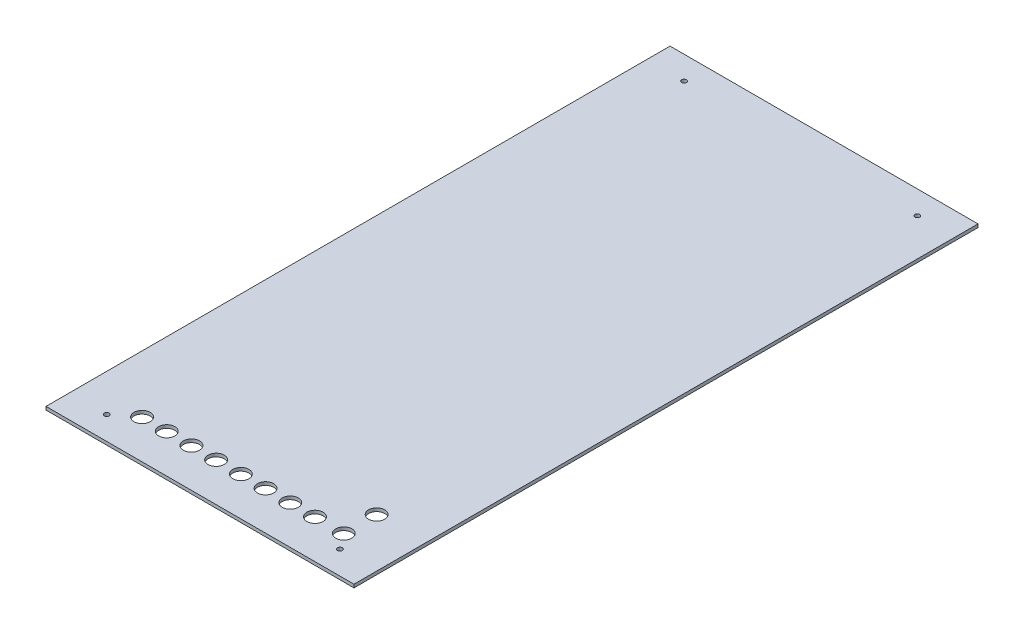
ISO-10303-21;
HEADER;
FILE_DESCRIPTION(('STEP AP214'),'2;1');
FILE_NAME('part.step','',(''),(''),'','','');
FILE_SCHEMA(('AUTOMOTIVE_DESIGN { 1 0 10303 214 1 1 1 1 }'));
ENDSEC;
DATA;
#1=APPLICATION_CONTEXT('core data for automotive mechanical design processes');
#2=APPLICATION_PROTOCOL_DEFINITION('international standard','automotive_design',2000,#1);
#3=PRODUCT_CONTEXT('',#1,'mechanical');
#4=PRODUCT('Part','Part','',(#3));
#5=PRODUCT_RELATED_PRODUCT_CATEGORY('part','',(#4));
#6=PRODUCT_DEFINITION_FORMATION('','',#4);
#7=PRODUCT_DEFINITION_CONTEXT('part definition',#1,'design');
#8=PRODUCT_DEFINITION('design','',#6,#7);
#9=PRODUCT_DEFINITION_SHAPE('','',#8);
#10=(LENGTH_UNIT() NAMED_UNIT(*) SI_UNIT(.MILLI.,.METRE.));
#11=(NAMED_UNIT(*) PLANE_ANGLE_UNIT() SI_UNIT($,.RADIAN.));
#12=(NAMED_UNIT(*) SI_UNIT($,.STERADIAN.) SOLID_ANGLE_UNIT());
#13=UNCERTAINTY_MEASURE_WITH_UNIT(LENGTH_MEASURE(1.E-05),#10,'distance_accuracy_value','');
#14=(GEOMETRIC_REPRESENTATION_CONTEXT(3) GLOBAL_UNCERTAINTY_ASSIGNED_CONTEXT((#13)) GLOBAL_UNIT_ASSIGNED_CONTEXT((#10,
#11,#12)) REPRESENTATION_CONTEXT('',''));
#15=CARTESIAN_POINT('',(0.,0.,0.));
#16=DIRECTION('',(0.,0.,1.));
#17=DIRECTION('',(1.,0.,0.));
#18=AXIS2_PLACEMENT_3D('',#15,#16,#17);
#19=CARTESIAN_POINT('',(95.,2.,0.));
#20=DIRECTION('',(1.,0.,0.));
#21=DIRECTION('',(0.,0.,-1.));
#22=AXIS2_PLACEMENT_3D('',#19,#20,#21);
#23=PLANE('',#22);
#24=DIRECTION('',(0.,0.,1.));
#25=VECTOR('',#24,1.);
#26=CARTESIAN_POINT('',(95.,0.,0.));
#27=LINE('',#26,#25);
#28=CARTESIAN_POINT('',(95.,0.,-192.5));
#29=VERTEX_POINT('',#28);
#30=CARTESIAN_POINT('',(95.,0.,192.5));
#31=VERTEX_POINT('',#30);
#32=EDGE_CURVE('E148',#29,#31,#27,.T.);
#33=ORIENTED_EDGE('',*,*,#32,.F.);
#34=DIRECTION('',(0.,-1.,0.));
#35=VECTOR('',#34,1.);
#36=CARTESIAN_POINT('',(95.,2.,-192.5));
#37=LINE('',#36,#35);
#38=CARTESIAN_POINT('',(95.,2.,-192.5));
#39=VERTEX_POINT('',#38);
#40=EDGE_CURVE('E11',#39,#29,#37,.T.);
#41=ORIENTED_EDGE('',*,*,#40,.F.);
#42=DIRECTION('',(0.,0.,1.));
#43=VECTOR('',#42,1.);
#44=CARTESIAN_POINT('',(95.,2.,0.));
#45=LINE('',#44,#43);
#46=CARTESIAN_POINT('',(95.,2.,192.5));
#47=VERTEX_POINT('',#46);
#48=EDGE_CURVE('E100',#39,#47,#45,.T.);
#49=ORIENTED_EDGE('',*,*,#48,.T.);
#50=DIRECTION('',(0.,-1.,0.));
#51=VECTOR('',#50,1.);
#52=CARTESIAN_POINT('',(95.,2.,192.5));
#53=LINE('',#52,#51);
#54=EDGE_CURVE('E80',#47,#31,#53,.T.);
#55=ORIENTED_EDGE('',*,*,#54,.T.);
#56=EDGE_LOOP('',(#33,#41,#49,#55));
#57=FACE_BOUND('',#56,.T.);
#58=ADVANCED_FACE('F42',(#57),#23,.T.);
#59=CARTESIAN_POINT('',(0.,2.,-192.5));
#60=DIRECTION('',(0.,0.,-1.));
#61=DIRECTION('',(-1.,0.,0.));
#62=AXIS2_PLACEMENT_3D('',#59,#60,#61);
#63=PLANE('',#62);
#64=DIRECTION('',(1.,0.,0.));
#65=VECTOR('',#64,1.);
#66=CARTESIAN_POINT('',(0.,0.,-192.5));
#67=LINE('',#66,#65);
#68=CARTESIAN_POINT('',(-95.,0.,-192.5));
#69=VERTEX_POINT('',#68);
#70=EDGE_CURVE('E93',#69,#29,#67,.T.);
#71=ORIENTED_EDGE('',*,*,#70,.F.);
#72=DIRECTION('',(0.,-1.,0.));
#73=VECTOR('',#72,1.);
#74=CARTESIAN_POINT('',(-95.,2.,-192.5));
#75=LINE('',#74,#73);
#76=CARTESIAN_POINT('',(-95.,2.,-192.5));
#77=VERTEX_POINT('',#76);
#78=EDGE_CURVE('E50',#77,#69,#75,.T.);
#79=ORIENTED_EDGE('',*,*,#78,.F.);
#80=DIRECTION('',(1.,0.,0.));
#81=VECTOR('',#80,1.);
#82=CARTESIAN_POINT('',(0.,2.,-192.5));
#83=LINE('',#82,#81);
#84=EDGE_CURVE('E91',#77,#39,#83,.T.);
#85=ORIENTED_EDGE('',*,*,#84,.T.);
#86=ORIENTED_EDGE('',*,*,#40,.T.);
#87=EDGE_LOOP('',(#71,#79,#85,#86));
#88=FACE_BOUND('',#87,.T.);
#89=ADVANCED_FACE('F89',(#88),#63,.T.);
#90=CARTESIAN_POINT('',(-95.,2.,0.));
#91=DIRECTION('',(1.,0.,0.));
#92=DIRECTION('',(0.,0.,-1.));
#93=AXIS2_PLACEMENT_3D('',#90,#91,#92);
#94=PLANE('',#93);
#95=DIRECTION('',(0.,0.,1.));
#96=VECTOR('',#95,1.);
#97=CARTESIAN_POINT('',(-95.,0.,0.));
#98=LINE('',#97,#96);
#99=CARTESIAN_POINT('',(-95.,0.,192.5));
#100=VERTEX_POINT('',#99);
#101=EDGE_CURVE('E73',#69,#100,#98,.T.);
#102=ORIENTED_EDGE('',*,*,#101,.T.);
#103=DIRECTION('',(0.,-1.,0.));
#104=VECTOR('',#103,1.);
#105=CARTESIAN_POINT('',(-95.,2.,192.5));
#106=LINE('',#105,#104);
#107=CARTESIAN_POINT('',(-95.,2.,192.5));
#108=VERTEX_POINT('',#107);
#109=EDGE_CURVE('E94',#108,#100,#106,.T.);
#110=ORIENTED_EDGE('',*,*,#109,.F.);
#111=DIRECTION('',(0.,0.,1.));
#112=VECTOR('',#111,1.);
#113=CARTESIAN_POINT('',(-95.,2.,0.));
#114=LINE('',#113,#112);
#115=EDGE_CURVE('E95',#77,#108,#114,.T.);
#116=ORIENTED_EDGE('',*,*,#115,.F.);
#117=ORIENTED_EDGE('',*,*,#78,.T.);
#118=EDGE_LOOP('',(#102,#110,#116,#117));
#119=FACE_BOUND('',#118,.T.);
#120=ADVANCED_FACE('F96',(#119),#94,.F.);
#121=CARTESIAN_POINT('',(71.9300000000001,2.,178.11));
#122=DIRECTION('',(0.,-1.,0.));
#123=DIRECTION('',(0.,0.,-1.));
#124=AXIS2_PLACEMENT_3D('',#121,#122,#123);
#125=CYLINDRICAL_SURFACE('',#124,1.5);
#126=CARTESIAN_POINT('',(71.9300000000001,2.,178.11));
#127=DIRECTION('',(0.,1.,0.));
#128=DIRECTION('',(0.,0.,1.));
#129=AXIS2_PLACEMENT_3D('',#126,#127,#128);
#130=CIRCLE('',#129,1.5);
#131=CARTESIAN_POINT('',(71.9300000000001,2.,179.61));
#132=VERTEX_POINT('',#131);
#133=EDGE_CURVE('E142',#132,#132,#130,.T.);
#134=ORIENTED_EDGE('',*,*,#133,.T.);
#135=EDGE_LOOP('',(#134));
#136=FACE_BOUND('',#135,.T.);
#137=CARTESIAN_POINT('',(71.9300000000001,0.,178.11));
#138=DIRECTION('',(0.,1.,0.));
#139=DIRECTION('',(0.,0.,1.));
#140=AXIS2_PLACEMENT_3D('',#137,#138,#139);
#141=CIRCLE('',#140,1.5);
#142=CARTESIAN_POINT('',(71.9300000000001,0.,179.61));
#143=VERTEX_POINT('',#142);
#144=EDGE_CURVE('E191',#143,#143,#141,.T.);
#145=ORIENTED_EDGE('',*,*,#144,.F.);
#146=EDGE_LOOP('',(#145));
#147=FACE_BOUND('',#146,.T.);
#148=ADVANCED_FACE('F210',(#136,#147),#125,.F.);
#149=CARTESIAN_POINT('',(-59.69,2.,168.55));
#150=DIRECTION('',(0.,-1.,0.));
#151=DIRECTION('',(0.,0.,-1.));
#152=AXIS2_PLACEMENT_3D('',#149,#150,#151);
#153=CYLINDRICAL_SURFACE('',#152,5.);
#154=CARTESIAN_POINT('',(-59.69,2.,168.55));
#155=DIRECTION('',(0.,1.,0.));
#156=DIRECTION('',(0.,0.,1.));
#157=AXIS2_PLACEMENT_3D('',#154,#155,#156);
#158=CIRCLE('',#157,5.);
#159=CARTESIAN_POINT('',(-59.69,2.,173.55));
#160=VERTEX_POINT('',#159);
#161=EDGE_CURVE('E139',#160,#160,#158,.T.);
#162=ORIENTED_EDGE('',*,*,#161,.T.);
#163=EDGE_LOOP('',(#162));
#164=FACE_BOUND('',#163,.T.);
#165=CARTESIAN_POINT('',(-59.69,0.,168.55));
#166=DIRECTION('',(0.,1.,0.));
#167=DIRECTION('',(0.,0.,1.));
#168=AXIS2_PLACEMENT_3D('',#165,#166,#167);
#169=CIRCLE('',#168,5.);
#170=CARTESIAN_POINT('',(-59.69,0.,173.55));
#171=VERTEX_POINT('',#170);
#172=EDGE_CURVE('E188',#171,#171,#169,.T.);
#173=ORIENTED_EDGE('',*,*,#172,.F.);
#174=EDGE_LOOP('',(#173));
#175=FACE_BOUND('',#174,.T.);
#176=ADVANCED_FACE('F259',(#164,#175),#153,.F.);
#177=CARTESIAN_POINT('',(-44.45,2.,168.55));
#178=DIRECTION('',(0.,-1.,0.));
#179=DIRECTION('',(0.,0.,-1.));
#180=AXIS2_PLACEMENT_3D('',#177,#178,#179);
#181=CYLINDRICAL_SURFACE('',#180,4.99999999999999);
#182=CARTESIAN_POINT('',(-44.45,2.,168.55));
#183=DIRECTION('',(0.,1.,0.));
#184=DIRECTION('',(0.,0.,1.));
#185=AXIS2_PLACEMENT_3D('',#182,#183,#184);
#186=CIRCLE('',#185,4.99999999999999);
#187=CARTESIAN_POINT('',(-44.45,2.,173.55));
#188=VERTEX_POINT('',#187);
#189=EDGE_CURVE('E136',#188,#188,#186,.T.);
#190=ORIENTED_EDGE('',*,*,#189,.T.);
#191=EDGE_LOOP('',(#190));
#192=FACE_BOUND('',#191,.T.);
#193=CARTESIAN_POINT('',(-44.45,0.,168.55));
#194=DIRECTION('',(0.,1.,0.));
#195=DIRECTION('',(0.,0.,1.));
#196=AXIS2_PLACEMENT_3D('',#193,#194,#195);
#197=CIRCLE('',#196,4.99999999999999);
#198=CARTESIAN_POINT('',(-44.45,0.,173.55));
#199=VERTEX_POINT('',#198);
#200=EDGE_CURVE('E185',#199,#199,#197,.T.);
#201=ORIENTED_EDGE('',*,*,#200,.F.);
#202=EDGE_LOOP('',(#201));
#203=FACE_BOUND('',#202,.T.);
#204=ADVANCED_FACE('F255',(#192,#203),#181,.F.);
#205=CARTESIAN_POINT('',(-29.21,2.,168.55));
#206=DIRECTION('',(0.,-1.,0.));
#207=DIRECTION('',(0.,0.,-1.));
#208=AXIS2_PLACEMENT_3D('',#205,#206,#207);
#209=CYLINDRICAL_SURFACE('',#208,5.);
#210=CARTESIAN_POINT('',(-29.21,2.,168.55));
#211=DIRECTION('',(0.,1.,0.));
#212=DIRECTION('',(0.,0.,1.));
#213=AXIS2_PLACEMENT_3D('',#210,#211,#212);
#214=CIRCLE('',#213,5.);
#215=CARTESIAN_POINT('',(-29.21,2.,173.55));
#216=VERTEX_POINT('',#215);
#217=EDGE_CURVE('E133',#216,#216,#214,.T.);
#218=ORIENTED_EDGE('',*,*,#217,.T.);
#219=EDGE_LOOP('',(#218));
#220=FACE_BOUND('',#219,.T.);
#221=CARTESIAN_POINT('',(-29.21,0.,168.55));
#222=DIRECTION('',(0.,1.,0.));
#223=DIRECTION('',(0.,0.,1.));
#224=AXIS2_PLACEMENT_3D('',#221,#222,#223);
#225=CIRCLE('',#224,5.);
#226=CARTESIAN_POINT('',(-29.21,0.,173.55));
#227=VERTEX_POINT('',#226);
#228=EDGE_CURVE('E182',#227,#227,#225,.T.);
#229=ORIENTED_EDGE('',*,*,#228,.F.);
#230=EDGE_LOOP('',(#229));
#231=FACE_BOUND('',#230,.T.);
#232=ADVANCED_FACE('F251',(#220,#231),#209,.F.);
#233=CARTESIAN_POINT('',(-13.97,2.,168.55));
#234=DIRECTION('',(0.,-1.,0.));
#235=DIRECTION('',(0.,0.,-1.));
#236=AXIS2_PLACEMENT_3D('',#233,#234,#235);
#237=CYLINDRICAL_SURFACE('',#236,5.);
#238=CARTESIAN_POINT('',(-13.97,2.,168.55));
#239=DIRECTION('',(0.,1.,0.));
#240=DIRECTION('',(0.,0.,1.));
#241=AXIS2_PLACEMENT_3D('',#238,#239,#240);
#242=CIRCLE('',#241,5.);
#243=CARTESIAN_POINT('',(-13.97,2.,173.55));
#244=VERTEX_POINT('',#243);
#245=EDGE_CURVE('E130',#244,#244,#242,.T.);
#246=ORIENTED_EDGE('',*,*,#245,.T.);
#247=EDGE_LOOP('',(#246));
#248=FACE_BOUND('',#247,.T.);
#249=CARTESIAN_POINT('',(-13.97,0.,168.55));
#250=DIRECTION('',(0.,1.,0.));
#251=DIRECTION('',(0.,0.,1.));
#252=AXIS2_PLACEMENT_3D('',#249,#250,#251);
#253=CIRCLE('',#252,5.);
#254=CARTESIAN_POINT('',(-13.97,0.,173.55));
#255=VERTEX_POINT('',#254);
#256=EDGE_CURVE('E179',#255,#255,#253,.T.);
#257=ORIENTED_EDGE('',*,*,#256,.F.);
#258=EDGE_LOOP('',(#257));
#259=FACE_BOUND('',#258,.T.);
#260=ADVANCED_FACE('F247',(#248,#259),#237,.F.);
#261=CARTESIAN_POINT('',(1.26999999999999,2.,168.55));
#262=DIRECTION('',(0.,-1.,0.));
#263=DIRECTION('',(0.,0.,-1.));
#264=AXIS2_PLACEMENT_3D('',#261,#262,#263);
#265=CYLINDRICAL_SURFACE('',#264,5.);
#266=CARTESIAN_POINT('',(1.26999999999999,2.,168.55));
#267=DIRECTION('',(0.,1.,0.));
#268=DIRECTION('',(0.,0.,1.));
#269=AXIS2_PLACEMENT_3D('',#266,#267,#268);
#270=CIRCLE('',#269,5.);
#271=CARTESIAN_POINT('',(1.26999999999999,2.,173.55));
#272=VERTEX_POINT('',#271);
#273=EDGE_CURVE('E127',#272,#272,#270,.T.);
#274=ORIENTED_EDGE('',*,*,#273,.T.);
#275=EDGE_LOOP('',(#274));
#276=FACE_BOUND('',#275,.T.);
#277=CARTESIAN_POINT('',(1.26999999999999,0.,168.55));
#278=DIRECTION('',(0.,1.,0.));
#279=DIRECTION('',(0.,0.,1.));
#280=AXIS2_PLACEMENT_3D('',#277,#278,#279);
#281=CIRCLE('',#280,5.);
#282=CARTESIAN_POINT('',(1.26999999999999,0.,173.55));
#283=VERTEX_POINT('',#282);
#284=EDGE_CURVE('E176',#283,#283,#281,.T.);
#285=ORIENTED_EDGE('',*,*,#284,.F.);
#286=EDGE_LOOP('',(#285));
#287=FACE_BOUND('',#286,.T.);
#288=ADVANCED_FACE('F243',(#276,#287),#265,.F.);
#289=CARTESIAN_POINT('',(16.51,2.,168.55));
#290=DIRECTION('',(0.,-1.,0.));
#291=DIRECTION('',(0.,0.,-1.));
#292=AXIS2_PLACEMENT_3D('',#289,#290,#291);
#293=CYLINDRICAL_SURFACE('',#292,5.);
#294=CARTESIAN_POINT('',(16.51,2.,168.55));
#295=DIRECTION('',(0.,1.,0.));
#296=DIRECTION('',(0.,0.,1.));
#297=AXIS2_PLACEMENT_3D('',#294,#295,#296);
#298=CIRCLE('',#297,5.);
#299=CARTESIAN_POINT('',(16.51,2.,173.55));
#300=VERTEX_POINT('',#299);
#301=EDGE_CURVE('E124',#300,#300,#298,.T.);
#302=ORIENTED_EDGE('',*,*,#301,.T.);
#303=EDGE_LOOP('',(#302));
#304=FACE_BOUND('',#303,.T.);
#305=CARTESIAN_POINT('',(16.51,0.,168.55));
#306=DIRECTION('',(0.,1.,0.));
#307=DIRECTION('',(0.,0.,1.));
#308=AXIS2_PLACEMENT_3D('',#305,#306,#307);
#309=CIRCLE('',#308,5.);
#310=CARTESIAN_POINT('',(16.51,0.,173.55));
#311=VERTEX_POINT('',#310);
#312=EDGE_CURVE('E173',#311,#311,#309,.T.);
#313=ORIENTED_EDGE('',*,*,#312,.F.);
#314=EDGE_LOOP('',(#313));
#315=FACE_BOUND('',#314,.T.);
#316=ADVANCED_FACE('F239',(#304,#315),#293,.F.);
#317=CARTESIAN_POINT('',(31.75,2.,168.55));
#318=DIRECTION('',(0.,-1.,0.));
#319=DIRECTION('',(0.,0.,-1.));
#320=AXIS2_PLACEMENT_3D('',#317,#318,#319);
#321=CYLINDRICAL_SURFACE('',#320,5.);
#322=CARTESIAN_POINT('',(31.75,2.,168.55));
#323=DIRECTION('',(0.,1.,0.));
#324=DIRECTION('',(0.,0.,1.));
#325=AXIS2_PLACEMENT_3D('',#322,#323,#324);
#326=CIRCLE('',#325,5.);
#327=CARTESIAN_POINT('',(31.75,2.,173.55));
#328=VERTEX_POINT('',#327);
#329=EDGE_CURVE('E121',#328,#328,#326,.T.);
#330=ORIENTED_EDGE('',*,*,#329,.T.);
#331=EDGE_LOOP('',(#330));
#332=FACE_BOUND('',#331,.T.);
#333=CARTESIAN_POINT('',(31.75,0.,168.55));
#334=DIRECTION('',(0.,1.,0.));
#335=DIRECTION('',(0.,0.,1.));
#336=AXIS2_PLACEMENT_3D('',#333,#334,#335);
#337=CIRCLE('',#336,5.);
#338=CARTESIAN_POINT('',(31.75,0.,173.55));
#339=VERTEX_POINT('',#338);
#340=EDGE_CURVE('E170',#339,#339,#337,.T.);
#341=ORIENTED_EDGE('',*,*,#340,.F.);
#342=EDGE_LOOP('',(#341));
#343=FACE_BOUND('',#342,.T.);
#344=ADVANCED_FACE('F235',(#332,#343),#321,.F.);
#345=CARTESIAN_POINT('',(46.99,2.,168.55));
#346=DIRECTION('',(0.,-1.,0.));
#347=DIRECTION('',(0.,0.,-1.));
#348=AXIS2_PLACEMENT_3D('',#345,#346,#347);
#349=CYLINDRICAL_SURFACE('',#348,5.);
#350=CARTESIAN_POINT('',(46.99,2.,168.55));
#351=DIRECTION('',(0.,1.,0.));
#352=DIRECTION('',(0.,0.,1.));
#353=AXIS2_PLACEMENT_3D('',#350,#351,#352);
#354=CIRCLE('',#353,5.);
#355=CARTESIAN_POINT('',(46.99,2.,173.55));
#356=VERTEX_POINT('',#355);
#357=EDGE_CURVE('E118',#356,#356,#354,.T.);
#358=ORIENTED_EDGE('',*,*,#357,.T.);
#359=EDGE_LOOP('',(#358));
#360=FACE_BOUND('',#359,.T.);
#361=CARTESIAN_POINT('',(46.99,0.,168.55));
#362=DIRECTION('',(0.,1.,0.));
#363=DIRECTION('',(0.,0.,1.));
#364=AXIS2_PLACEMENT_3D('',#361,#362,#363);
#365=CIRCLE('',#364,5.);
#366=CARTESIAN_POINT('',(46.99,0.,173.55));
#367=VERTEX_POINT('',#366);
#368=EDGE_CURVE('E167',#367,#367,#365,.T.);
#369=ORIENTED_EDGE('',*,*,#368,.F.);
#370=EDGE_LOOP('',(#369));
#371=FACE_BOUND('',#370,.T.);
#372=ADVANCED_FACE('F231',(#360,#371),#349,.F.);
#373=CARTESIAN_POINT('',(64.77,2.,168.55));
#374=DIRECTION('',(0.,-1.,0.));
#375=DIRECTION('',(0.,0.,-1.));
#376=AXIS2_PLACEMENT_3D('',#373,#374,#375);
#377=CYLINDRICAL_SURFACE('',#376,5.00000000000001);
#378=CARTESIAN_POINT('',(64.77,2.,168.55));
#379=DIRECTION('',(0.,1.,0.));
#380=DIRECTION('',(0.,0.,1.));
#381=AXIS2_PLACEMENT_3D('',#378,#379,#380);
#382=CIRCLE('',#381,5.00000000000001);
#383=CARTESIAN_POINT('',(64.77,2.,173.55));
#384=VERTEX_POINT('',#383);
#385=EDGE_CURVE('E115',#384,#384,#382,.T.);
#386=ORIENTED_EDGE('',*,*,#385,.T.);
#387=EDGE_LOOP('',(#386));
#388=FACE_BOUND('',#387,.T.);
#389=CARTESIAN_POINT('',(64.77,0.,168.55));
#390=DIRECTION('',(0.,1.,0.));
#391=DIRECTION('',(0.,0.,1.));
#392=AXIS2_PLACEMENT_3D('',#389,#390,#391);
#393=CIRCLE('',#392,5.00000000000001);
#394=CARTESIAN_POINT('',(64.77,0.,173.55));
#395=VERTEX_POINT('',#394);
#396=EDGE_CURVE('E164',#395,#395,#393,.T.);
#397=ORIENTED_EDGE('',*,*,#396,.F.);
#398=EDGE_LOOP('',(#397));
#399=FACE_BOUND('',#398,.T.);
#400=ADVANCED_FACE('F227',(#388,#399),#377,.F.);
#401=CARTESIAN_POINT('',(64.77,2.,148.27));
#402=DIRECTION('',(0.,-1.,0.));
#403=DIRECTION('',(0.,0.,-1.));
#404=AXIS2_PLACEMENT_3D('',#401,#402,#403);
#405=CYLINDRICAL_SURFACE('',#404,5.00000000000001);
#406=CARTESIAN_POINT('',(64.77,2.,148.27));
#407=DIRECTION('',(0.,1.,0.));
#408=DIRECTION('',(0.,0.,1.));
#409=AXIS2_PLACEMENT_3D('',#406,#407,#408);
#410=CIRCLE('',#409,5.00000000000001);
#411=CARTESIAN_POINT('',(64.77,2.,153.27));
#412=VERTEX_POINT('',#411);
#413=EDGE_CURVE('E112',#412,#412,#410,.T.);
#414=ORIENTED_EDGE('',*,*,#413,.T.);
#415=EDGE_LOOP('',(#414));
#416=FACE_BOUND('',#415,.T.);
#417=CARTESIAN_POINT('',(64.77,0.,148.27));
#418=DIRECTION('',(0.,1.,0.));
#419=DIRECTION('',(0.,0.,1.));
#420=AXIS2_PLACEMENT_3D('',#417,#418,#419);
#421=CIRCLE('',#420,5.00000000000001);
#422=CARTESIAN_POINT('',(64.77,0.,153.27));
#423=VERTEX_POINT('',#422);
#424=EDGE_CURVE('E161',#423,#423,#421,.T.);
#425=ORIENTED_EDGE('',*,*,#424,.F.);
#426=EDGE_LOOP('',(#425));
#427=FACE_BOUND('',#426,.T.);
#428=ADVANCED_FACE('F223',(#416,#427),#405,.F.);
#429=CARTESIAN_POINT('',(-71.93,2.,-178.11));
#430=DIRECTION('',(0.,-1.,0.));
#431=DIRECTION('',(0.,0.,-1.));
#432=AXIS2_PLACEMENT_3D('',#429,#430,#431);
#433=CYLINDRICAL_SURFACE('',#432,1.5);
#434=CARTESIAN_POINT('',(-71.93,2.,-178.11));
#435=DIRECTION('',(0.,1.,0.));
#436=DIRECTION('',(0.,0.,1.));
#437=AXIS2_PLACEMENT_3D('',#434,#435,#436);
#438=CIRCLE('',#437,1.5);
#439=CARTESIAN_POINT('',(-71.93,2.,-176.61));
#440=VERTEX_POINT('',#439);
#441=EDGE_CURVE('E109',#440,#440,#438,.T.);
#442=ORIENTED_EDGE('',*,*,#441,.T.);
#443=EDGE_LOOP('',(#442));
#444=FACE_BOUND('',#443,.T.);
#445=CARTESIAN_POINT('',(-71.93,0.,-178.11));
#446=DIRECTION('',(0.,1.,0.));
#447=DIRECTION('',(0.,0.,1.));
#448=AXIS2_PLACEMENT_3D('',#445,#446,#447);
#449=CIRCLE('',#448,1.5);
#450=CARTESIAN_POINT('',(-71.93,0.,-176.61));
#451=VERTEX_POINT('',#450);
#452=EDGE_CURVE('E158',#451,#451,#449,.T.);
#453=ORIENTED_EDGE('',*,*,#452,.F.);
#454=EDGE_LOOP('',(#453));
#455=FACE_BOUND('',#454,.T.);
#456=ADVANCED_FACE('F219',(#444,#455),#433,.F.);
#457=CARTESIAN_POINT('',(71.9300000000001,2.,-178.11));
#458=DIRECTION('',(0.,-1.,0.));
#459=DIRECTION('',(0.,0.,-1.));
#460=AXIS2_PLACEMENT_3D('',#457,#458,#459);
#461=CYLINDRICAL_SURFACE('',#460,1.5);
#462=CARTESIAN_POINT('',(71.9300000000001,2.,-178.11));
#463=DIRECTION('',(0.,1.,0.));
#464=DIRECTION('',(0.,0.,1.));
#465=AXIS2_PLACEMENT_3D('',#462,#463,#464);
#466=CIRCLE('',#465,1.5);
#467=CARTESIAN_POINT('',(71.9300000000001,2.,-176.61));
#468=VERTEX_POINT('',#467);
#469=EDGE_CURVE('E106',#468,#468,#466,.F.);
#470=ORIENTED_EDGE('',*,*,#469,.F.);
#471=EDGE_LOOP('',(#470));
#472=FACE_BOUND('',#471,.T.);
#473=CARTESIAN_POINT('',(71.9300000000001,0.,-178.11));
#474=DIRECTION('',(0.,1.,0.));
#475=DIRECTION('',(0.,0.,1.));
#476=AXIS2_PLACEMENT_3D('',#473,#474,#475);
#477=CIRCLE('',#476,1.5);
#478=CARTESIAN_POINT('',(71.9300000000001,0.,-176.61));
#479=VERTEX_POINT('',#478);
#480=EDGE_CURVE('E155',#479,#479,#477,.F.);
#481=ORIENTED_EDGE('',*,*,#480,.T.);
#482=EDGE_LOOP('',(#481));
#483=FACE_BOUND('',#482,.T.);
#484=ADVANCED_FACE('F216',(#472,#483),#461,.F.);
#485=CARTESIAN_POINT('',(0.,2.,192.5));
#486=DIRECTION('',(0.,0.,-1.));
#487=DIRECTION('',(-1.,0.,0.));
#488=AXIS2_PLACEMENT_3D('',#485,#486,#487);
#489=PLANE('',#488);
#490=DIRECTION('',(1.,0.,0.));
#491=VECTOR('',#490,1.);
#492=CARTESIAN_POINT('',(0.,0.,192.5));
#493=LINE('',#492,#491);
#494=EDGE_CURVE('E153',#100,#31,#493,.T.);
#495=ORIENTED_EDGE('',*,*,#494,.T.);
#496=ORIENTED_EDGE('',*,*,#54,.F.);
#497=DIRECTION('',(1.,0.,0.));
#498=VECTOR('',#497,1.);
#499=CARTESIAN_POINT('',(0.,2.,192.5));
#500=LINE('',#499,#498);
#501=EDGE_CURVE('E58',#108,#47,#500,.T.);
#502=ORIENTED_EDGE('',*,*,#501,.F.);
#503=ORIENTED_EDGE('',*,*,#109,.T.);
#504=EDGE_LOOP('',(#495,#496,#502,#503));
#505=FACE_BOUND('',#504,.T.);
#506=ADVANCED_FACE('F199',(#505),#489,.F.);
#507=CARTESIAN_POINT('',(-71.93,2.,178.11));
#508=DIRECTION('',(0.,-1.,0.));
#509=DIRECTION('',(0.,0.,-1.));
#510=AXIS2_PLACEMENT_3D('',#507,#508,#509);
#511=CYLINDRICAL_SURFACE('',#510,1.5);
#512=CARTESIAN_POINT('',(-71.93,2.,178.11));
#513=DIRECTION('',(0.,1.,0.));
#514=DIRECTION('',(0.,0.,1.));
#515=AXIS2_PLACEMENT_3D('',#512,#513,#514);
#516=CIRCLE('',#515,1.5);
#517=CARTESIAN_POINT('',(-71.93,2.,179.61));
#518=VERTEX_POINT('',#517);
#519=EDGE_CURVE('E145',#518,#518,#516,.F.);
#520=ORIENTED_EDGE('',*,*,#519,.F.);
#521=EDGE_LOOP('',(#520));
#522=FACE_BOUND('',#521,.T.);
#523=CARTESIAN_POINT('',(-71.93,0.,178.11));
#524=DIRECTION('',(0.,1.,0.));
#525=DIRECTION('',(0.,0.,1.));
#526=AXIS2_PLACEMENT_3D('',#523,#524,#525);
#527=CIRCLE('',#526,1.5);
#528=CARTESIAN_POINT('',(-71.93,0.,179.61));
#529=VERTEX_POINT('',#528);
#530=EDGE_CURVE('E102',#529,#529,#527,.F.);
#531=ORIENTED_EDGE('',*,*,#530,.T.);
#532=EDGE_LOOP('',(#531));
#533=FACE_BOUND('',#532,.T.);
#534=ADVANCED_FACE('F215',(#522,#533),#511,.F.);
#535=CARTESIAN_POINT('',(0.,2.,0.));
#536=DIRECTION('',(0.,1.,0.));
#537=DIRECTION('',(0.,0.,1.));
#538=AXIS2_PLACEMENT_3D('',#535,#536,#537);
#539=PLANE('',#538);
#540=ORIENTED_EDGE('',*,*,#48,.F.);
#541=ORIENTED_EDGE('',*,*,#84,.F.);
#542=ORIENTED_EDGE('',*,*,#115,.T.);
#543=ORIENTED_EDGE('',*,*,#501,.T.);
#544=EDGE_LOOP('',(#540,#541,#542,#543));
#545=FACE_BOUND('',#544,.T.);
#546=ORIENTED_EDGE('',*,*,#469,.T.);
#547=EDGE_LOOP('',(#546));
#548=FACE_BOUND('',#547,.T.);
#549=ORIENTED_EDGE('',*,*,#441,.F.);
#550=EDGE_LOOP('',(#549));
#551=FACE_BOUND('',#550,.T.);
#552=ORIENTED_EDGE('',*,*,#413,.F.);
#553=EDGE_LOOP('',(#552));
#554=FACE_BOUND('',#553,.T.);
#555=ORIENTED_EDGE('',*,*,#385,.F.);
#556=EDGE_LOOP('',(#555));
#557=FACE_BOUND('',#556,.T.);
#558=ORIENTED_EDGE('',*,*,#357,.F.);
#559=EDGE_LOOP('',(#558));
#560=FACE_BOUND('',#559,.T.);
#561=ORIENTED_EDGE('',*,*,#329,.F.);
#562=EDGE_LOOP('',(#561));
#563=FACE_BOUND('',#562,.T.);
#564=ORIENTED_EDGE('',*,*,#301,.F.);
#565=EDGE_LOOP('',(#564));
#566=FACE_BOUND('',#565,.T.);
#567=ORIENTED_EDGE('',*,*,#273,.F.);
#568=EDGE_LOOP('',(#567));
#569=FACE_BOUND('',#568,.T.);
#570=ORIENTED_EDGE('',*,*,#245,.F.);
#571=EDGE_LOOP('',(#570));
#572=FACE_BOUND('',#571,.T.);
#573=ORIENTED_EDGE('',*,*,#217,.F.);
#574=EDGE_LOOP('',(#573));
#575=FACE_BOUND('',#574,.T.);
#576=ORIENTED_EDGE('',*,*,#189,.F.);
#577=EDGE_LOOP('',(#576));
#578=FACE_BOUND('',#577,.T.);
#579=ORIENTED_EDGE('',*,*,#161,.F.);
#580=EDGE_LOOP('',(#579));
#581=FACE_BOUND('',#580,.T.);
#582=ORIENTED_EDGE('',*,*,#133,.F.);
#583=EDGE_LOOP('',(#582));
#584=FACE_BOUND('',#583,.T.);
#585=ORIENTED_EDGE('',*,*,#519,.T.);
#586=EDGE_LOOP('',(#585));
#587=FACE_BOUND('',#586,.T.);
#588=ADVANCED_FACE('F98',(#545,#548,#551,#554,#557,#560,#563,#566,#569,#572,#575,#578,#581,#584,
#587),#539,.T.);
#589=CARTESIAN_POINT('',(0.,0.,0.));
#590=DIRECTION('',(0.,1.,0.));
#591=DIRECTION('',(0.,0.,1.));
#592=AXIS2_PLACEMENT_3D('',#589,#590,#591);
#593=PLANE('',#592);
#594=ORIENTED_EDGE('',*,*,#32,.T.);
#595=ORIENTED_EDGE('',*,*,#494,.F.);
#596=ORIENTED_EDGE('',*,*,#101,.F.);
#597=ORIENTED_EDGE('',*,*,#70,.T.);
#598=EDGE_LOOP('',(#594,#595,#596,#597));
#599=FACE_BOUND('',#598,.T.);
#600=ORIENTED_EDGE('',*,*,#480,.F.);
#601=EDGE_LOOP('',(#600));
#602=FACE_BOUND('',#601,.T.);
#603=ORIENTED_EDGE('',*,*,#452,.T.);
#604=EDGE_LOOP('',(#603));
#605=FACE_BOUND('',#604,.T.);
#606=ORIENTED_EDGE('',*,*,#424,.T.);
#607=EDGE_LOOP('',(#606));
#608=FACE_BOUND('',#607,.T.);
#609=ORIENTED_EDGE('',*,*,#396,.T.);
#610=EDGE_LOOP('',(#609));
#611=FACE_BOUND('',#610,.T.);
#612=ORIENTED_EDGE('',*,*,#368,.T.);
#613=EDGE_LOOP('',(#612));
#614=FACE_BOUND('',#613,.T.);
#615=ORIENTED_EDGE('',*,*,#340,.T.);
#616=EDGE_LOOP('',(#615));
#617=FACE_BOUND('',#616,.T.);
#618=ORIENTED_EDGE('',*,*,#312,.T.);
#619=EDGE_LOOP('',(#618));
#620=FACE_BOUND('',#619,.T.);
#621=ORIENTED_EDGE('',*,*,#284,.T.);
#622=EDGE_LOOP('',(#621));
#623=FACE_BOUND('',#622,.T.);
#624=ORIENTED_EDGE('',*,*,#256,.T.);
#625=EDGE_LOOP('',(#624));
#626=FACE_BOUND('',#625,.T.);
#627=ORIENTED_EDGE('',*,*,#228,.T.);
#628=EDGE_LOOP('',(#627));
#629=FACE_BOUND('',#628,.T.);
#630=ORIENTED_EDGE('',*,*,#200,.T.);
#631=EDGE_LOOP('',(#630));
#632=FACE_BOUND('',#631,.T.);
#633=ORIENTED_EDGE('',*,*,#172,.T.);
#634=EDGE_LOOP('',(#633));
#635=FACE_BOUND('',#634,.T.);
#636=ORIENTED_EDGE('',*,*,#144,.T.);
#637=EDGE_LOOP('',(#636));
#638=FACE_BOUND('',#637,.T.);
#639=ORIENTED_EDGE('',*,*,#530,.F.);
#640=EDGE_LOOP('',(#639));
#641=FACE_BOUND('',#640,.T.);
#642=ADVANCED_FACE('F201',(#599,#602,#605,#608,#611,#614,#617,#620,#623,#626,#629,#632,#635,
#638,#641),#593,.F.);
#643=CLOSED_SHELL('',(#58,#89,#120,#148,#176,#204,#232,#260,#288,#316,#344,#372,#400,#428,#456,
#484,#506,#534,#588,#642));
#644=MANIFOLD_SOLID_BREP('B2',#643);
#645=ADVANCED_BREP_SHAPE_REPRESENTATION('',(#18,#644),#14);
#646=SHAPE_DEFINITION_REPRESENTATION(#9,#645);
ENDSEC;
END-ISO-10303-21;
